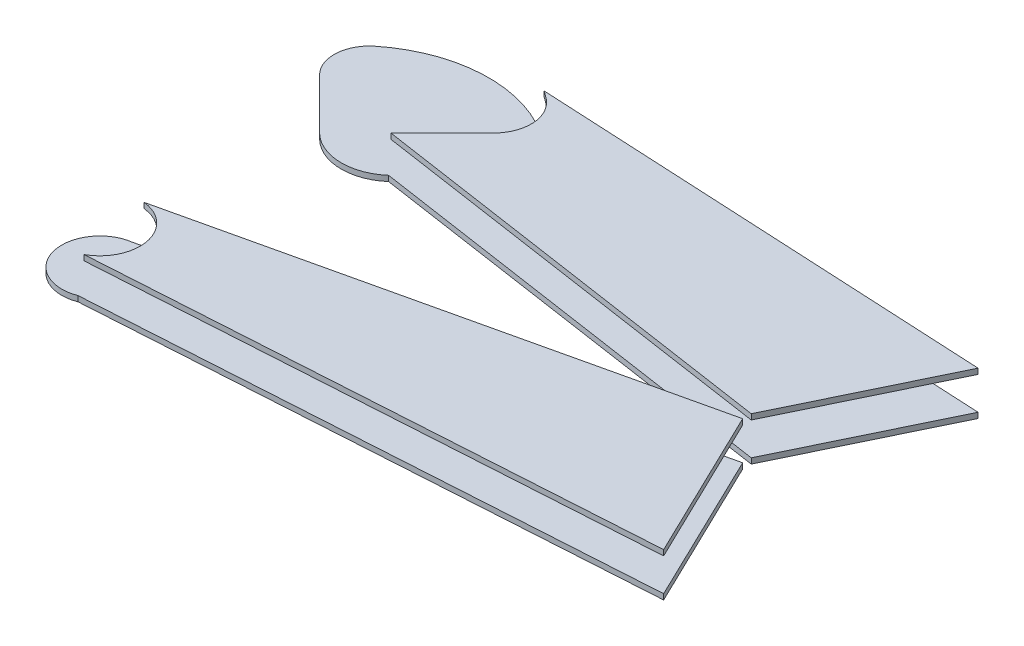
ISO-10303-21;
HEADER;
FILE_DESCRIPTION(('STEP AP214'),'2;1');
FILE_NAME('part.step','',(''),(''),'','','');
FILE_SCHEMA(('AUTOMOTIVE_DESIGN { 1 0 10303 214 1 1 1 1 }'));
ENDSEC;
DATA;
#1=APPLICATION_CONTEXT('core data for automotive mechanical design processes');
#2=APPLICATION_PROTOCOL_DEFINITION('international standard','automotive_design',2000,#1);
#3=PRODUCT_CONTEXT('',#1,'mechanical');
#4=PRODUCT('Part','Part','',(#3));
#5=PRODUCT_RELATED_PRODUCT_CATEGORY('part','',(#4));
#6=PRODUCT_DEFINITION_FORMATION('','',#4);
#7=PRODUCT_DEFINITION_CONTEXT('part definition',#1,'design');
#8=PRODUCT_DEFINITION('design','',#6,#7);
#9=PRODUCT_DEFINITION_SHAPE('','',#8);
#10=(LENGTH_UNIT() NAMED_UNIT(*) SI_UNIT(.MILLI.,.METRE.));
#11=(NAMED_UNIT(*) PLANE_ANGLE_UNIT() SI_UNIT($,.RADIAN.));
#12=(NAMED_UNIT(*) SI_UNIT($,.STERADIAN.) SOLID_ANGLE_UNIT());
#13=UNCERTAINTY_MEASURE_WITH_UNIT(LENGTH_MEASURE(1.E-05),#10,'distance_accuracy_value','');
#14=(GEOMETRIC_REPRESENTATION_CONTEXT(3) GLOBAL_UNCERTAINTY_ASSIGNED_CONTEXT((#13)) GLOBAL_UNIT_ASSIGNED_CONTEXT((#10,
#11,#12)) REPRESENTATION_CONTEXT('',''));
#15=CARTESIAN_POINT('',(0.,0.,0.));
#16=DIRECTION('',(0.,0.,1.));
#17=DIRECTION('',(1.,0.,0.));
#18=AXIS2_PLACEMENT_3D('',#15,#16,#17);
#19=CARTESIAN_POINT('',(-838.420331603245,-128.524,-220.531428961004));
#20=DIRECTION('',(0.0505562536303922,0.,-0.998721214963845));
#21=DIRECTION('',(-0.998721214963845,0.,-0.0505562536303922));
#22=AXIS2_PLACEMENT_3D('',#19,#20,#21);
#23=PLANE('',#22);
#24=DIRECTION('',(0.,1.,0.));
#25=VECTOR('',#24,1.);
#26=CARTESIAN_POINT('',(-629.067259374009,-172.973999999995,-209.933769815147));
#27=LINE('',#26,#25);
#28=CARTESIAN_POINT('',(-629.06725937401,-122.174,-209.933769815147));
#29=VERTEX_POINT('',#28);
#30=CARTESIAN_POINT('',(-629.067259374009,-128.524,-209.933769815147));
#31=VERTEX_POINT('',#30);
#32=EDGE_CURVE('E93',#29,#31,#27,.F.);
#33=ORIENTED_EDGE('',*,*,#32,.F.);
#34=DIRECTION('',(-0.998721214963845,0.,-0.0505562536303922));
#35=VECTOR('',#34,1.);
#36=CARTESIAN_POINT('',(-838.420331603245,-122.174,-220.531428961004));
#37=LINE('',#36,#35);
#38=CARTESIAN_POINT('',(-96.9999999999999,-122.174,-183.));
#39=VERTEX_POINT('',#38);
#40=EDGE_CURVE('E90',#39,#29,#37,.T.);
#41=ORIENTED_EDGE('',*,*,#40,.F.);
#42=DIRECTION('',(0.,1.,0.));
#43=VECTOR('',#42,1.);
#44=CARTESIAN_POINT('',(-96.9999999999999,-128.524,-183.));
#45=LINE('',#44,#43);
#46=CARTESIAN_POINT('',(-96.9999999999999,-128.524,-183.));
#47=VERTEX_POINT('',#46);
#48=EDGE_CURVE('E66',#47,#39,#45,.T.);
#49=ORIENTED_EDGE('',*,*,#48,.F.);
#50=DIRECTION('',(-0.998721214963845,0.,-0.0505562536303922));
#51=VECTOR('',#50,1.);
#52=CARTESIAN_POINT('',(-838.420331603245,-128.524,-220.531428961004));
#53=LINE('',#52,#51);
#54=EDGE_CURVE('E109',#47,#31,#53,.T.);
#55=ORIENTED_EDGE('',*,*,#54,.T.);
#56=EDGE_LOOP('',(#33,#41,#49,#55));
#57=FACE_BOUND('',#56,.T.);
#58=ADVANCED_FACE('F43',(#57),#23,.T.);
#59=CARTESIAN_POINT('',(-216.392471738032,-128.524,64.1146508066245));
#60=DIRECTION('',(0.900415007238885,0.,0.435031969789576));
#61=DIRECTION('',(0.435031969789576,0.,-0.900415007238885));
#62=AXIS2_PLACEMENT_3D('',#59,#60,#61);
#63=PLANE('',#62);
#64=DIRECTION('',(0.435031969789576,0.,-0.900415007238885));
#65=VECTOR('',#64,1.);
#66=CARTESIAN_POINT('',(-216.392471738032,-122.174,64.1146508066245));
#67=LINE('',#66,#65);
#68=CARTESIAN_POINT('',(-183.,-122.174,-5.00000000000005));
#69=VERTEX_POINT('',#68);
#70=EDGE_CURVE('E82',#69,#39,#67,.T.);
#71=ORIENTED_EDGE('',*,*,#70,.F.);
#72=DIRECTION('',(0.,1.,0.));
#73=VECTOR('',#72,1.);
#74=CARTESIAN_POINT('',(-183.,-128.524,-5.00000000000005));
#75=LINE('',#74,#73);
#76=CARTESIAN_POINT('',(-183.,-128.524,-5.00000000000005));
#77=VERTEX_POINT('',#76);
#78=EDGE_CURVE('E86',#77,#69,#75,.T.);
#79=ORIENTED_EDGE('',*,*,#78,.F.);
#80=DIRECTION('',(0.435031969789576,0.,-0.900415007238885));
#81=VECTOR('',#80,1.);
#82=CARTESIAN_POINT('',(-216.392471738032,-128.524,64.1146508066245));
#83=LINE('',#82,#81);
#84=EDGE_CURVE('E84',#77,#47,#83,.T.);
#85=ORIENTED_EDGE('',*,*,#84,.T.);
#86=ORIENTED_EDGE('',*,*,#48,.T.);
#87=EDGE_LOOP('',(#71,#79,#85,#86));
#88=FACE_BOUND('',#87,.T.);
#89=ADVANCED_FACE('F79',(#88),#63,.T.);
#90=CARTESIAN_POINT('',(-857.084771467849,-128.524,-105.222131912697));
#91=DIRECTION('',(-0.147062275293934,0.,0.989127235084229));
#92=DIRECTION('',(0.989127235084229,0.,0.147062275293934));
#93=AXIS2_PLACEMENT_3D('',#90,#91,#92);
#94=PLANE('',#93);
#95=DIRECTION('',(0.,1.,0.));
#96=VECTOR('',#95,1.);
#97=CARTESIAN_POINT('',(-675.952387640038,-172.973999999995,-78.2915818779856));
#98=LINE('',#97,#96);
#99=CARTESIAN_POINT('',(-675.952387640038,-128.524,-78.2915818779856));
#100=VERTEX_POINT('',#99);
#101=CARTESIAN_POINT('',(-675.952387640038,-122.174,-78.2915818779856));
#102=VERTEX_POINT('',#101);
#103=EDGE_CURVE('E142',#100,#102,#98,.T.);
#104=ORIENTED_EDGE('',*,*,#103,.F.);
#105=DIRECTION('',(0.989127235084229,0.,0.147062275293934));
#106=VECTOR('',#105,1.);
#107=CARTESIAN_POINT('',(-857.084771467849,-128.524,-105.222131912697));
#108=LINE('',#107,#106);
#109=EDGE_CURVE('E96',#100,#77,#108,.T.);
#110=ORIENTED_EDGE('',*,*,#109,.T.);
#111=ORIENTED_EDGE('',*,*,#78,.T.);
#112=DIRECTION('',(0.989127235084229,0.,0.147062275293934));
#113=VECTOR('',#112,1.);
#114=CARTESIAN_POINT('',(-857.084771467849,-122.174,-105.222131912697));
#115=LINE('',#114,#113);
#116=EDGE_CURVE('E101',#102,#69,#115,.T.);
#117=ORIENTED_EDGE('',*,*,#116,.F.);
#118=EDGE_LOOP('',(#104,#110,#111,#117));
#119=FACE_BOUND('',#118,.T.);
#120=ADVANCED_FACE('F45',(#119),#94,.T.);
#121=CARTESIAN_POINT('',(-719.067867535307,-128.524,-124.701940777126));
#122=DIRECTION('',(0.,1.,0.));
#123=DIRECTION('',(0.,0.,1.));
#124=AXIS2_PLACEMENT_3D('',#121,#122,#123);
#125=PLANE('',#124);
#126=ORIENTED_EDGE('',*,*,#109,.F.);
#127=CARTESIAN_POINT('',(-719.067867535307,-128.524,-124.701940777126));
#128=DIRECTION('',(0.,1.,0.));
#129=DIRECTION('',(0.,0.,1.));
#130=AXIS2_PLACEMENT_3D('',#127,#128,#129);
#131=CIRCLE('',#130,63.34718636014);
#132=CARTESIAN_POINT('',(-674.274642490964,-128.524,-79.9087157327826));
#133=VERTEX_POINT('',#132);
#134=EDGE_CURVE('E104',#100,#133,#131,.T.);
#135=ORIENTED_EDGE('',*,*,#134,.T.);
#136=DIRECTION('',(0.707106781186547,0.,-0.707106781186548));
#137=VECTOR('',#136,1.);
#138=CARTESIAN_POINT('',(-674.274642490964,-128.524,-79.9087157327827));
#139=LINE('',#138,#137);
#140=CARTESIAN_POINT('',(-615.88666149142,-128.524,-138.296696732326));
#141=VERTEX_POINT('',#140);
#142=EDGE_CURVE('E161',#133,#141,#139,.T.);
#143=ORIENTED_EDGE('',*,*,#142,.T.);
#144=CARTESIAN_POINT('',(-646.537750912032,-128.524,-168.947786152938));
#145=DIRECTION('',(0.,1.,0.));
#146=DIRECTION('',(0.,0.,1.));
#147=AXIS2_PLACEMENT_3D('',#144,#145,#146);
#148=CIRCLE('',#147,43.3471863601399);
#149=CARTESIAN_POINT('',(-619.375967050333,-128.524,-202.729675721034));
#150=VERTEX_POINT('',#149);
#151=EDGE_CURVE('E156',#141,#150,#148,.T.);
#152=ORIENTED_EDGE('',*,*,#151,.T.);
#153=CARTESIAN_POINT('',(-719.067867535307,-128.524,-78.74));
#154=DIRECTION('',(0.,1.,0.));
#155=DIRECTION('',(0.,0.,1.));
#156=AXIS2_PLACEMENT_3D('',#153,#154,#155);
#157=CIRCLE('',#156,159.09718636014);
#158=EDGE_CURVE('E149',#150,#31,#157,.T.);
#159=ORIENTED_EDGE('',*,*,#158,.T.);
#160=ORIENTED_EDGE('',*,*,#54,.F.);
#161=ORIENTED_EDGE('',*,*,#84,.F.);
#162=EDGE_LOOP('',(#126,#135,#143,#152,#159,#160,#161));
#163=FACE_BOUND('',#162,.T.);
#164=ADVANCED_FACE('F151',(#163),#125,.F.);
#165=CARTESIAN_POINT('',(-719.067867535307,-122.174,-124.701940777126));
#166=DIRECTION('',(0.,1.,0.));
#167=DIRECTION('',(0.,0.,1.));
#168=AXIS2_PLACEMENT_3D('',#165,#166,#167);
#169=PLANE('',#168);
#170=CARTESIAN_POINT('',(-719.067867535307,-122.174,-124.701940777126));
#171=DIRECTION('',(0.,1.,0.));
#172=DIRECTION('',(0.,0.,1.));
#173=AXIS2_PLACEMENT_3D('',#170,#171,#172);
#174=CIRCLE('',#173,63.34718636014);
#175=CARTESIAN_POINT('',(-674.274642490964,-122.174,-79.9087157327826));
#176=VERTEX_POINT('',#175);
#177=EDGE_CURVE('E12',#102,#176,#174,.T.);
#178=ORIENTED_EDGE('',*,*,#177,.F.);
#179=ORIENTED_EDGE('',*,*,#116,.T.);
#180=ORIENTED_EDGE('',*,*,#70,.T.);
#181=ORIENTED_EDGE('',*,*,#40,.T.);
#182=CARTESIAN_POINT('',(-719.067867535307,-122.174,-78.74));
#183=DIRECTION('',(0.,1.,0.));
#184=DIRECTION('',(0.,0.,1.));
#185=AXIS2_PLACEMENT_3D('',#182,#183,#184);
#186=CIRCLE('',#185,159.09718636014);
#187=CARTESIAN_POINT('',(-619.375967050333,-122.174,-202.729675721034));
#188=VERTEX_POINT('',#187);
#189=EDGE_CURVE('E51',#188,#29,#186,.T.);
#190=ORIENTED_EDGE('',*,*,#189,.F.);
#191=CARTESIAN_POINT('',(-646.537750912032,-122.174,-168.947786152938));
#192=DIRECTION('',(0.,1.,0.));
#193=DIRECTION('',(0.,0.,1.));
#194=AXIS2_PLACEMENT_3D('',#191,#192,#193);
#195=CIRCLE('',#194,43.3471863601399);
#196=CARTESIAN_POINT('',(-615.88666149142,-122.174,-138.296696732326));
#197=VERTEX_POINT('',#196);
#198=EDGE_CURVE('E111',#197,#188,#195,.T.);
#199=ORIENTED_EDGE('',*,*,#198,.F.);
#200=DIRECTION('',(0.707106781186547,0.,-0.707106781186548));
#201=VECTOR('',#200,1.);
#202=CARTESIAN_POINT('',(-674.274642490964,-122.174,-79.9087157327827));
#203=LINE('',#202,#201);
#204=EDGE_CURVE('E85',#176,#197,#203,.T.);
#205=ORIENTED_EDGE('',*,*,#204,.F.);
#206=EDGE_LOOP('',(#178,#179,#180,#181,#190,#199,#205));
#207=FACE_BOUND('',#206,.T.);
#208=ADVANCED_FACE('F99',(#207),#169,.T.);
#209=CARTESIAN_POINT('',(-719.067867535307,-172.973999999995,-124.701940777126));
#210=DIRECTION('',(0.,1.,0.));
#211=DIRECTION('',(0.,0.,1.));
#212=AXIS2_PLACEMENT_3D('',#209,#210,#211);
#213=CYLINDRICAL_SURFACE('',#212,63.34718636014);
#214=ORIENTED_EDGE('',*,*,#103,.T.);
#215=ORIENTED_EDGE('',*,*,#177,.T.);
#216=DIRECTION('',(0.,1.,0.));
#217=VECTOR('',#216,1.);
#218=CARTESIAN_POINT('',(-674.274642490964,-172.973999999995,-79.9087157327826));
#219=LINE('',#218,#217);
#220=EDGE_CURVE('E58',#133,#176,#219,.T.);
#221=ORIENTED_EDGE('',*,*,#220,.F.);
#222=ORIENTED_EDGE('',*,*,#134,.F.);
#223=EDGE_LOOP('',(#214,#215,#221,#222));
#224=FACE_BOUND('',#223,.T.);
#225=ADVANCED_FACE('F141',(#224),#213,.F.);
#226=CARTESIAN_POINT('',(-719.067867535307,-172.973999999995,-78.74));
#227=DIRECTION('',(0.,1.,0.));
#228=DIRECTION('',(0.,0.,1.));
#229=AXIS2_PLACEMENT_3D('',#226,#227,#228);
#230=CYLINDRICAL_SURFACE('',#229,159.09718636014);
#231=DIRECTION('',(0.,1.,0.));
#232=VECTOR('',#231,1.);
#233=CARTESIAN_POINT('',(-619.375967050333,-172.973999999995,-202.729675721034));
#234=LINE('',#233,#232);
#235=EDGE_CURVE('E122',#150,#188,#234,.T.);
#236=ORIENTED_EDGE('',*,*,#235,.T.);
#237=ORIENTED_EDGE('',*,*,#189,.T.);
#238=ORIENTED_EDGE('',*,*,#32,.T.);
#239=ORIENTED_EDGE('',*,*,#158,.F.);
#240=EDGE_LOOP('',(#236,#237,#238,#239));
#241=FACE_BOUND('',#240,.T.);
#242=ADVANCED_FACE('F116',(#241),#230,.F.);
#243=CARTESIAN_POINT('',(-646.537750912032,-172.973999999995,-168.947786152938));
#244=DIRECTION('',(0.,1.,0.));
#245=DIRECTION('',(0.,0.,1.));
#246=AXIS2_PLACEMENT_3D('',#243,#244,#245);
#247=CYLINDRICAL_SURFACE('',#246,43.3471863601399);
#248=DIRECTION('',(0.,1.,0.));
#249=VECTOR('',#248,1.);
#250=CARTESIAN_POINT('',(-615.88666149142,-172.973999999995,-138.296696732326));
#251=LINE('',#250,#249);
#252=EDGE_CURVE('E164',#141,#197,#251,.T.);
#253=ORIENTED_EDGE('',*,*,#252,.T.);
#254=ORIENTED_EDGE('',*,*,#198,.T.);
#255=ORIENTED_EDGE('',*,*,#235,.F.);
#256=ORIENTED_EDGE('',*,*,#151,.F.);
#257=EDGE_LOOP('',(#253,#254,#255,#256));
#258=FACE_BOUND('',#257,.T.);
#259=ADVANCED_FACE('F167',(#258),#247,.F.);
#260=CARTESIAN_POINT('',(-674.274642490964,-172.973999999995,-79.9087157327826));
#261=DIRECTION('',(0.707106781186548,0.,0.707106781186547));
#262=DIRECTION('',(0.707106781186547,0.,-0.707106781186548));
#263=AXIS2_PLACEMENT_3D('',#260,#261,#262);
#264=PLANE('',#263);
#265=ORIENTED_EDGE('',*,*,#220,.T.);
#266=ORIENTED_EDGE('',*,*,#204,.T.);
#267=ORIENTED_EDGE('',*,*,#252,.F.);
#268=ORIENTED_EDGE('',*,*,#142,.F.);
#269=EDGE_LOOP('',(#265,#266,#267,#268));
#270=FACE_BOUND('',#269,.T.);
#271=ADVANCED_FACE('F169',(#270),#264,.F.);
#272=CLOSED_SHELL('',(#58,#89,#120,#164,#208,#225,#242,#259,#271));
#273=MANIFOLD_SOLID_BREP('B2',#272);
#274=CARTESIAN_POINT('',(-808.496769315492,-128.524,227.706016824532));
#275=DIRECTION('',(0.0627100890896896,0.,0.998031785428883));
#276=DIRECTION('',(0.998031785428883,0.,-0.0627100890896896));
#277=AXIS2_PLACEMENT_3D('',#274,#275,#276);
#278=PLANE('',#277);
#279=DIRECTION('',(0.,1.,0.));
#280=VECTOR('',#279,1.);
#281=CARTESIAN_POINT('',(-731.974677377489,-172.973999999995,222.897846110109));
#282=LINE('',#281,#280);
#283=CARTESIAN_POINT('',(-731.974677377489,-128.524,222.897846110109));
#284=VERTEX_POINT('',#283);
#285=CARTESIAN_POINT('',(-731.974677377489,-122.174,222.897846110109));
#286=VERTEX_POINT('',#285);
#287=EDGE_CURVE('E267',#284,#286,#282,.T.);
#288=ORIENTED_EDGE('',*,*,#287,.F.);
#289=DIRECTION('',(0.998031785428883,0.,-0.0627100890896896));
#290=VECTOR('',#289,1.);
#291=CARTESIAN_POINT('',(-808.496769315492,-128.524,227.706016824532));
#292=LINE('',#291,#290);
#293=CARTESIAN_POINT('',(-97.,-128.524,183.));
#294=VERTEX_POINT('',#293);
#295=EDGE_CURVE('E304',#284,#294,#292,.T.);
#296=ORIENTED_EDGE('',*,*,#295,.T.);
#297=DIRECTION('',(0.,1.,0.));
#298=VECTOR('',#297,1.);
#299=CARTESIAN_POINT('',(-97.,-128.524,183.));
#300=LINE('',#299,#298);
#301=CARTESIAN_POINT('',(-97.,-122.174,183.));
#302=VERTEX_POINT('',#301);
#303=EDGE_CURVE('E294',#294,#302,#300,.T.);
#304=ORIENTED_EDGE('',*,*,#303,.T.);
#305=DIRECTION('',(0.998031785428883,0.,-0.0627100890896896));
#306=VECTOR('',#305,1.);
#307=CARTESIAN_POINT('',(-808.496769315492,-122.174,227.706016824532));
#308=LINE('',#307,#306);
#309=EDGE_CURVE('E308',#286,#302,#308,.T.);
#310=ORIENTED_EDGE('',*,*,#309,.F.);
#311=EDGE_LOOP('',(#288,#296,#304,#310));
#312=FACE_BOUND('',#311,.T.);
#313=ADVANCED_FACE('F254',(#312),#278,.T.);
#314=CARTESIAN_POINT('',(-752.09528534578,-128.524,135.888115134921));
#315=DIRECTION('',(-0.224141511684438,0.,-0.974556608278768));
#316=DIRECTION('',(-0.974556608278768,0.,0.224141511684438));
#317=AXIS2_PLACEMENT_3D('',#314,#315,#316);
#318=PLANE('',#317);
#319=DIRECTION('',(0.,1.,0.));
#320=VECTOR('',#319,1.);
#321=CARTESIAN_POINT('',(-749.475530412088,-172.973999999995,135.285588995247));
#322=LINE('',#321,#320);
#323=CARTESIAN_POINT('',(-749.475530412087,-122.174,135.285588995247));
#324=VERTEX_POINT('',#323);
#325=CARTESIAN_POINT('',(-749.475530412088,-128.524,135.285588995247));
#326=VERTEX_POINT('',#325);
#327=EDGE_CURVE('E302',#324,#326,#322,.F.);
#328=ORIENTED_EDGE('',*,*,#327,.F.);
#329=DIRECTION('',(-0.974556608278767,0.,0.224141511684438));
#330=VECTOR('',#329,1.);
#331=CARTESIAN_POINT('',(-752.09528534578,-122.174,135.888115134921));
#332=LINE('',#331,#330);
#333=CARTESIAN_POINT('',(-183.,-122.174,5.));
#334=VERTEX_POINT('',#333);
#335=EDGE_CURVE('E298',#334,#324,#332,.T.);
#336=ORIENTED_EDGE('',*,*,#335,.F.);
#337=DIRECTION('',(0.,1.,0.));
#338=VECTOR('',#337,1.);
#339=CARTESIAN_POINT('',(-183.,-128.524,5.));
#340=LINE('',#339,#338);
#341=CARTESIAN_POINT('',(-183.,-128.524,5.));
#342=VERTEX_POINT('',#341);
#343=EDGE_CURVE('E261',#342,#334,#340,.T.);
#344=ORIENTED_EDGE('',*,*,#343,.F.);
#345=DIRECTION('',(-0.974556608278767,0.,0.224141511684438));
#346=VECTOR('',#345,1.);
#347=CARTESIAN_POINT('',(-752.09528534578,-128.524,135.888115134921));
#348=LINE('',#347,#346);
#349=EDGE_CURVE('E314',#342,#326,#348,.T.);
#350=ORIENTED_EDGE('',*,*,#349,.T.);
#351=EDGE_LOOP('',(#328,#336,#344,#350));
#352=FACE_BOUND('',#351,.T.);
#353=ADVANCED_FACE('F299',(#352),#318,.T.);
#354=CARTESIAN_POINT('',(-401.30782525425,-128.524,-446.84642901461));
#355=DIRECTION('',(0.900415007238886,0.,-0.435031969789574));
#356=DIRECTION('',(-0.435031969789574,0.,-0.900415007238886));
#357=AXIS2_PLACEMENT_3D('',#354,#355,#356);
#358=PLANE('',#357);
#359=DIRECTION('',(-0.435031969789574,0.,-0.900415007238886));
#360=VECTOR('',#359,1.);
#361=CARTESIAN_POINT('',(-401.30782525425,-122.174,-446.84642901461));
#362=LINE('',#361,#360);
#363=EDGE_CURVE('E291',#302,#334,#362,.T.);
#364=ORIENTED_EDGE('',*,*,#363,.F.);
#365=ORIENTED_EDGE('',*,*,#303,.F.);
#366=DIRECTION('',(-0.435031969789574,0.,-0.900415007238886));
#367=VECTOR('',#366,1.);
#368=CARTESIAN_POINT('',(-401.30782525425,-128.524,-446.84642901461));
#369=LINE('',#368,#367);
#370=EDGE_CURVE('E293',#294,#342,#369,.T.);
#371=ORIENTED_EDGE('',*,*,#370,.T.);
#372=ORIENTED_EDGE('',*,*,#343,.T.);
#373=EDGE_LOOP('',(#364,#365,#371,#372));
#374=FACE_BOUND('',#373,.T.);
#375=ADVANCED_FACE('F288',(#374),#358,.T.);
#376=CARTESIAN_POINT('',(-754.50638834792,-128.524,181.844577047281));
#377=DIRECTION('',(0.,1.,0.));
#378=DIRECTION('',(0.,0.,1.));
#379=AXIS2_PLACEMENT_3D('',#376,#377,#378);
#380=PLANE('',#379);
#381=ORIENTED_EDGE('',*,*,#295,.F.);
#382=CARTESIAN_POINT('',(-754.50638834792,-128.524,181.844577047281));
#383=DIRECTION('',(0.,1.,0.));
#384=DIRECTION('',(0.,0.,1.));
#385=AXIS2_PLACEMENT_3D('',#382,#383,#384);
#386=CIRCLE('',#385,46.83);
#387=EDGE_CURVE('E311',#284,#326,#386,.T.);
#388=ORIENTED_EDGE('',*,*,#387,.T.);
#389=ORIENTED_EDGE('',*,*,#349,.F.);
#390=ORIENTED_EDGE('',*,*,#370,.F.);
#391=EDGE_LOOP('',(#381,#388,#389,#390));
#392=FACE_BOUND('',#391,.T.);
#393=ADVANCED_FACE('F327',(#392),#380,.F.);
#394=CARTESIAN_POINT('',(-754.50638834792,-122.174,181.844577047281));
#395=DIRECTION('',(0.,1.,0.));
#396=DIRECTION('',(0.,0.,1.));
#397=AXIS2_PLACEMENT_3D('',#394,#395,#396);
#398=PLANE('',#397);
#399=CARTESIAN_POINT('',(-754.50638834792,-122.174,181.844577047281));
#400=DIRECTION('',(0.,1.,0.));
#401=DIRECTION('',(0.,0.,1.));
#402=AXIS2_PLACEMENT_3D('',#399,#400,#401);
#403=CIRCLE('',#402,46.83);
#404=EDGE_CURVE('E41',#286,#324,#403,.T.);
#405=ORIENTED_EDGE('',*,*,#404,.F.);
#406=ORIENTED_EDGE('',*,*,#309,.T.);
#407=ORIENTED_EDGE('',*,*,#363,.T.);
#408=ORIENTED_EDGE('',*,*,#335,.T.);
#409=EDGE_LOOP('',(#405,#406,#407,#408));
#410=FACE_BOUND('',#409,.T.);
#411=ADVANCED_FACE('F306',(#410),#398,.T.);
#412=CARTESIAN_POINT('',(-754.50638834792,-172.973999999995,181.844577047281));
#413=DIRECTION('',(0.,1.,0.));
#414=DIRECTION('',(0.,0.,1.));
#415=AXIS2_PLACEMENT_3D('',#412,#413,#414);
#416=CYLINDRICAL_SURFACE('',#415,46.83);
#417=ORIENTED_EDGE('',*,*,#287,.T.);
#418=ORIENTED_EDGE('',*,*,#404,.T.);
#419=ORIENTED_EDGE('',*,*,#327,.T.);
#420=ORIENTED_EDGE('',*,*,#387,.F.);
#421=EDGE_LOOP('',(#417,#418,#419,#420));
#422=FACE_BOUND('',#421,.T.);
#423=ADVANCED_FACE('F323',(#422),#416,.F.);
#424=CLOSED_SHELL('',(#313,#353,#375,#393,#411,#423));
#425=MANIFOLD_SOLID_BREP('B6',#424);
#426=CARTESIAN_POINT('',(-719.067867535307,-166.623999999995,-78.74));
#427=DIRECTION('',(0.,-1.,0.));
#428=DIRECTION('',(0.,0.,-1.));
#429=AXIS2_PLACEMENT_3D('',#426,#427,#428);
#430=CYLINDRICAL_SURFACE('',#429,156.71718636014);
#431=CARTESIAN_POINT('',(-719.067867535307,-172.973999999995,-78.74));
#432=DIRECTION('',(0.,-1.,0.));
#433=DIRECTION('',(0.,0.,-1.));
#434=AXIS2_PLACEMENT_3D('',#431,#432,#433);
#435=CIRCLE('',#434,156.71718636014);
#436=CARTESIAN_POINT('',(-817.268436032693,-172.973999999995,-200.874863357802));
#437=VERTEX_POINT('',#436);
#438=CARTESIAN_POINT('',(-633.705018705783,-172.973999999995,-210.168537769948));
#439=VERTEX_POINT('',#438);
#440=EDGE_CURVE('E477',#437,#439,#435,.T.);
#441=ORIENTED_EDGE('',*,*,#440,.F.);
#442=DIRECTION('',(0.,-1.,0.));
#443=VECTOR('',#442,1.);
#444=CARTESIAN_POINT('',(-817.268436032693,-166.623999999995,-200.874863357802));
#445=LINE('',#444,#443);
#446=CARTESIAN_POINT('',(-817.268436032693,-166.623999999995,-200.874863357802));
#447=VERTEX_POINT('',#446);
#448=EDGE_CURVE('E252',#447,#437,#445,.T.);
#449=ORIENTED_EDGE('',*,*,#448,.F.);
#450=CARTESIAN_POINT('',(-719.067867535307,-166.623999999995,-78.74));
#451=DIRECTION('',(0.,-1.,0.));
#452=DIRECTION('',(0.,0.,-1.));
#453=AXIS2_PLACEMENT_3D('',#450,#451,#452);
#454=CIRCLE('',#453,156.71718636014);
#455=CARTESIAN_POINT('',(-633.705018705783,-166.623999999995,-210.168537769948));
#456=VERTEX_POINT('',#455);
#457=EDGE_CURVE('E494',#447,#456,#454,.T.);
#458=ORIENTED_EDGE('',*,*,#457,.T.);
#459=DIRECTION('',(0.,-1.,0.));
#460=VECTOR('',#459,1.);
#461=CARTESIAN_POINT('',(-633.705018705783,-166.623999999995,-210.168537769948));
#462=LINE('',#461,#460);
#463=EDGE_CURVE('E389',#456,#439,#462,.T.);
#464=ORIENTED_EDGE('',*,*,#463,.T.);
#465=EDGE_LOOP('',(#441,#449,#458,#464));
#466=FACE_BOUND('',#465,.T.);
#467=ADVANCED_FACE('F386',(#466),#430,.T.);
#468=CARTESIAN_POINT('',(-791.597984158582,-166.623999999995,-168.947786152938));
#469=DIRECTION('',(0.,-1.,0.));
#470=DIRECTION('',(0.,0.,-1.));
#471=AXIS2_PLACEMENT_3D('',#468,#469,#470);
#472=CYLINDRICAL_SURFACE('',#471,40.9671863601399);
#473=CARTESIAN_POINT('',(-791.597984158582,-172.973999999995,-168.947786152938));
#474=DIRECTION('',(0.,-1.,0.));
#475=DIRECTION('',(0.,0.,-1.));
#476=AXIS2_PLACEMENT_3D('',#473,#474,#475);
#477=CIRCLE('',#476,40.9671863601399);
#478=CARTESIAN_POINT('',(-820.566159439969,-172.973999999995,-139.97961087155));
#479=VERTEX_POINT('',#478);
#480=EDGE_CURVE('E492',#479,#437,#477,.T.);
#481=ORIENTED_EDGE('',*,*,#480,.F.);
#482=DIRECTION('',(0.,-1.,0.));
#483=VECTOR('',#482,1.);
#484=CARTESIAN_POINT('',(-820.566159439969,-166.623999999995,-139.97961087155));
#485=LINE('',#484,#483);
#486=CARTESIAN_POINT('',(-820.566159439969,-166.623999999995,-139.97961087155));
#487=VERTEX_POINT('',#486);
#488=EDGE_CURVE('E395',#487,#479,#485,.T.);
#489=ORIENTED_EDGE('',*,*,#488,.F.);
#490=CARTESIAN_POINT('',(-791.597984158582,-166.623999999995,-168.947786152938));
#491=DIRECTION('',(0.,-1.,0.));
#492=DIRECTION('',(0.,0.,-1.));
#493=AXIS2_PLACEMENT_3D('',#490,#491,#492);
#494=CIRCLE('',#493,40.9671863601399);
#495=EDGE_CURVE('E467',#487,#447,#494,.T.);
#496=ORIENTED_EDGE('',*,*,#495,.T.);
#497=ORIENTED_EDGE('',*,*,#448,.T.);
#498=EDGE_LOOP('',(#481,#489,#496,#497));
#499=FACE_BOUND('',#498,.T.);
#500=ADVANCED_FACE('F504',(#499),#472,.T.);
#501=CARTESIAN_POINT('',(-340.293274284209,-166.623999999995,340.293274284209));
#502=DIRECTION('',(-0.707106781186547,0.,0.707106781186548));
#503=DIRECTION('',(0.707106781186548,0.,0.707106781186547));
#504=AXIS2_PLACEMENT_3D('',#501,#502,#503);
#505=PLANE('',#504);
#506=DIRECTION('',(-0.707106781186548,0.,-0.707106781186547));
#507=VECTOR('',#506,1.);
#508=CARTESIAN_POINT('',(-340.293274284209,-172.973999999995,340.293274284209));
#509=LINE('',#508,#507);
#510=CARTESIAN_POINT('',(-762.178178440426,-172.973999999995,-81.5916298720067));
#511=VERTEX_POINT('',#510);
#512=EDGE_CURVE('E454',#511,#479,#509,.T.);
#513=ORIENTED_EDGE('',*,*,#512,.F.);
#514=DIRECTION('',(0.,-1.,0.));
#515=VECTOR('',#514,1.);
#516=CARTESIAN_POINT('',(-762.178178440426,-166.623999999995,-81.5916298720067));
#517=LINE('',#516,#515);
#518=CARTESIAN_POINT('',(-762.178178440426,-166.623999999995,-81.5916298720067));
#519=VERTEX_POINT('',#518);
#520=EDGE_CURVE('E449',#519,#511,#517,.T.);
#521=ORIENTED_EDGE('',*,*,#520,.F.);
#522=DIRECTION('',(-0.707106781186548,0.,-0.707106781186547));
#523=VECTOR('',#522,1.);
#524=CARTESIAN_POINT('',(-340.293274284209,-166.623999999995,340.293274284209));
#525=LINE('',#524,#523);
#526=EDGE_CURVE('E452',#519,#487,#525,.T.);
#527=ORIENTED_EDGE('',*,*,#526,.T.);
#528=ORIENTED_EDGE('',*,*,#488,.T.);
#529=EDGE_LOOP('',(#513,#521,#527,#528));
#530=FACE_BOUND('',#529,.T.);
#531=ADVANCED_FACE('F451',(#530),#505,.T.);
#532=CARTESIAN_POINT('',(-719.067867535307,-166.623999999995,-124.701940777126));
#533=DIRECTION('',(0.,-1.,0.));
#534=DIRECTION('',(0.,0.,-1.));
#535=AXIS2_PLACEMENT_3D('',#532,#533,#534);
#536=CYLINDRICAL_SURFACE('',#535,60.96718636014);
#537=CARTESIAN_POINT('',(-719.067867535307,-172.973999999995,-124.701940777126));
#538=DIRECTION('',(0.,-1.,0.));
#539=DIRECTION('',(0.,0.,-1.));
#540=AXIS2_PLACEMENT_3D('',#537,#538,#539);
#541=CIRCLE('',#540,60.96718636014);
#542=CARTESIAN_POINT('',(-679.005377883812,-172.973999999995,-78.7454968808023));
#543=VERTEX_POINT('',#542);
#544=EDGE_CURVE('E489',#543,#511,#541,.T.);
#545=ORIENTED_EDGE('',*,*,#544,.F.);
#546=DIRECTION('',(0.,-1.,0.));
#547=VECTOR('',#546,1.);
#548=CARTESIAN_POINT('',(-679.005377883812,-166.623999999995,-78.7454968808023));
#549=LINE('',#548,#547);
#550=CARTESIAN_POINT('',(-679.005377883812,-166.623999999995,-78.7454968808023));
#551=VERTEX_POINT('',#550);
#552=EDGE_CURVE('E459',#551,#543,#549,.T.);
#553=ORIENTED_EDGE('',*,*,#552,.F.);
#554=CARTESIAN_POINT('',(-719.067867535307,-166.623999999995,-124.701940777126));
#555=DIRECTION('',(0.,-1.,0.));
#556=DIRECTION('',(0.,0.,-1.));
#557=AXIS2_PLACEMENT_3D('',#554,#555,#556);
#558=CIRCLE('',#557,60.96718636014);
#559=EDGE_CURVE('E465',#551,#519,#558,.T.);
#560=ORIENTED_EDGE('',*,*,#559,.T.);
#561=ORIENTED_EDGE('',*,*,#520,.T.);
#562=EDGE_LOOP('',(#545,#553,#560,#561));
#563=FACE_BOUND('',#562,.T.);
#564=ADVANCED_FACE('F469',(#563),#536,.T.);
#565=CARTESIAN_POINT('',(-3.23048173634369,-166.623999999995,21.7279207837164));
#566=DIRECTION('',(-0.147062275293934,0.,0.989127235084229));
#567=DIRECTION('',(0.989127235084229,0.,0.147062275293934));
#568=AXIS2_PLACEMENT_3D('',#565,#566,#567);
#569=PLANE('',#568);
#570=DIRECTION('',(-0.989127235084229,0.,-0.147062275293934));
#571=VECTOR('',#570,1.);
#572=CARTESIAN_POINT('',(-3.23048173634369,-172.973999999995,21.7279207837164));
#573=LINE('',#572,#571);
#574=CARTESIAN_POINT('',(-183.,-172.973999999995,-5.00000000000001));
#575=VERTEX_POINT('',#574);
#576=EDGE_CURVE('E486',#575,#543,#573,.T.);
#577=ORIENTED_EDGE('',*,*,#576,.F.);
#578=DIRECTION('',(0.,-1.,0.));
#579=VECTOR('',#578,1.);
#580=CARTESIAN_POINT('',(-183.,-166.623999999995,-5.00000000000001));
#581=LINE('',#580,#579);
#582=CARTESIAN_POINT('',(-183.,-166.623999999995,-5.00000000000001));
#583=VERTEX_POINT('',#582);
#584=EDGE_CURVE('E498',#583,#575,#581,.T.);
#585=ORIENTED_EDGE('',*,*,#584,.F.);
#586=DIRECTION('',(-0.989127235084229,0.,-0.147062275293934));
#587=VECTOR('',#586,1.);
#588=CARTESIAN_POINT('',(-3.23048173634369,-166.623999999995,21.7279207837164));
#589=LINE('',#588,#587);
#590=EDGE_CURVE('E470',#583,#551,#589,.T.);
#591=ORIENTED_EDGE('',*,*,#590,.T.);
#592=ORIENTED_EDGE('',*,*,#552,.T.);
#593=EDGE_LOOP('',(#577,#585,#591,#592));
#594=FACE_BOUND('',#593,.T.);
#595=ADVANCED_FACE('F517',(#594),#569,.T.);
#596=CARTESIAN_POINT('',(-150.3252814739,-166.623999999995,-72.6290685772779));
#597=DIRECTION('',(0.900415007238885,0.,0.435031969789576));
#598=DIRECTION('',(0.435031969789576,0.,-0.900415007238885));
#599=AXIS2_PLACEMENT_3D('',#596,#597,#598);
#600=PLANE('',#599);
#601=DIRECTION('',(-0.435031969789576,0.,0.900415007238885));
#602=VECTOR('',#601,1.);
#603=CARTESIAN_POINT('',(-150.3252814739,-172.973999999995,-72.6290685772779));
#604=LINE('',#603,#602);
#605=CARTESIAN_POINT('',(-97.,-172.973999999995,-183.));
#606=VERTEX_POINT('',#605);
#607=EDGE_CURVE('E483',#606,#575,#604,.T.);
#608=ORIENTED_EDGE('',*,*,#607,.F.);
#609=DIRECTION('',(0.,-1.,0.));
#610=VECTOR('',#609,1.);
#611=CARTESIAN_POINT('',(-97.,-166.623999999995,-183.));
#612=LINE('',#611,#610);
#613=CARTESIAN_POINT('',(-97.,-166.623999999995,-183.));
#614=VERTEX_POINT('',#613);
#615=EDGE_CURVE('E499',#614,#606,#612,.T.);
#616=ORIENTED_EDGE('',*,*,#615,.F.);
#617=DIRECTION('',(-0.435031969789576,0.,0.900415007238885));
#618=VECTOR('',#617,1.);
#619=CARTESIAN_POINT('',(-150.3252814739,-166.623999999995,-72.6290685772779));
#620=LINE('',#619,#618);
#621=EDGE_CURVE('E472',#614,#583,#620,.T.);
#622=ORIENTED_EDGE('',*,*,#621,.T.);
#623=ORIENTED_EDGE('',*,*,#584,.T.);
#624=EDGE_LOOP('',(#608,#616,#622,#623));
#625=FACE_BOUND('',#624,.T.);
#626=ADVANCED_FACE('F520',(#625),#600,.T.);
#627=CARTESIAN_POINT('',(8.99203768433646,-166.623999999995,-177.634578439224));
#628=DIRECTION('',(0.0505562536303922,0.,-0.998721214963845));
#629=DIRECTION('',(-0.998721214963845,0.,-0.0505562536303922));
#630=AXIS2_PLACEMENT_3D('',#627,#628,#629);
#631=PLANE('',#630);
#632=DIRECTION('',(0.998721214963845,0.,0.0505562536303922));
#633=VECTOR('',#632,1.);
#634=CARTESIAN_POINT('',(8.99203768433646,-172.973999999995,-177.634578439224));
#635=LINE('',#634,#633);
#636=EDGE_CURVE('E480',#439,#606,#635,.T.);
#637=ORIENTED_EDGE('',*,*,#636,.F.);
#638=ORIENTED_EDGE('',*,*,#463,.F.);
#639=DIRECTION('',(0.998721214963845,0.,0.0505562536303922));
#640=VECTOR('',#639,1.);
#641=CARTESIAN_POINT('',(8.99203768433646,-166.623999999995,-177.634578439224));
#642=LINE('',#641,#640);
#643=EDGE_CURVE('E582',#456,#614,#642,.T.);
#644=ORIENTED_EDGE('',*,*,#643,.T.);
#645=ORIENTED_EDGE('',*,*,#615,.T.);
#646=EDGE_LOOP('',(#637,#638,#644,#645));
#647=FACE_BOUND('',#646,.T.);
#648=ADVANCED_FACE('F501',(#647),#631,.T.);
#649=CARTESIAN_POINT('',(-719.067867535307,-166.623999999995,-78.74));
#650=DIRECTION('',(0.,-1.,0.));
#651=DIRECTION('',(0.,0.,-1.));
#652=AXIS2_PLACEMENT_3D('',#649,#650,#651);
#653=PLANE('',#652);
#654=ORIENTED_EDGE('',*,*,#457,.F.);
#655=ORIENTED_EDGE('',*,*,#495,.F.);
#656=ORIENTED_EDGE('',*,*,#526,.F.);
#657=ORIENTED_EDGE('',*,*,#559,.F.);
#658=ORIENTED_EDGE('',*,*,#590,.F.);
#659=ORIENTED_EDGE('',*,*,#621,.F.);
#660=ORIENTED_EDGE('',*,*,#643,.F.);
#661=EDGE_LOOP('',(#654,#655,#656,#657,#658,#659,#660));
#662=FACE_BOUND('',#661,.T.);
#663=ADVANCED_FACE('F463',(#662),#653,.F.);
#664=CARTESIAN_POINT('',(-719.067867535307,-172.973999999995,-78.74));
#665=DIRECTION('',(0.,-1.,0.));
#666=DIRECTION('',(0.,0.,-1.));
#667=AXIS2_PLACEMENT_3D('',#664,#665,#666);
#668=PLANE('',#667);
#669=ORIENTED_EDGE('',*,*,#440,.T.);
#670=ORIENTED_EDGE('',*,*,#636,.T.);
#671=ORIENTED_EDGE('',*,*,#607,.T.);
#672=ORIENTED_EDGE('',*,*,#576,.T.);
#673=ORIENTED_EDGE('',*,*,#544,.T.);
#674=ORIENTED_EDGE('',*,*,#512,.T.);
#675=ORIENTED_EDGE('',*,*,#480,.T.);
#676=EDGE_LOOP('',(#669,#670,#671,#672,#673,#674,#675));
#677=FACE_BOUND('',#676,.T.);
#678=ADVANCED_FACE('F503',(#677),#668,.T.);
#679=CLOSED_SHELL('',(#467,#500,#531,#564,#595,#626,#648,#663,#678));
#680=MANIFOLD_SOLID_BREP('B35',#679);
#681=CARTESIAN_POINT('',(-8.10162040160548,-166.623999999995,-35.225459312805));
#682=DIRECTION('',(-0.224141511684438,0.,-0.974556608278768));
#683=DIRECTION('',(-0.974556608278768,0.,0.224141511684438));
#684=AXIS2_PLACEMENT_3D('',#681,#682,#683);
#685=PLANE('',#684);
#686=DIRECTION('',(0.974556608278767,0.,-0.224141511684438));
#687=VECTOR('',#686,1.);
#688=CARTESIAN_POINT('',(-8.10162040160548,-172.973999999995,-35.225459312805));
#689=LINE('',#688,#687);
#690=CARTESIAN_POINT('',(-760.286009911856,-172.973999999995,137.771927086362));
#691=VERTEX_POINT('',#690);
#692=CARTESIAN_POINT('',(-183.,-172.973999999995,4.99999999999999));
#693=VERTEX_POINT('',#692);
#694=EDGE_CURVE('E651',#691,#693,#689,.T.);
#695=ORIENTED_EDGE('',*,*,#694,.F.);
#696=DIRECTION('',(0.,-1.,0.));
#697=VECTOR('',#696,1.);
#698=CARTESIAN_POINT('',(-760.286009911856,-166.623999999995,137.771927086362));
#699=LINE('',#698,#697);
#700=CARTESIAN_POINT('',(-760.286009911856,-166.623999999995,137.771927086362));
#701=VERTEX_POINT('',#700);
#702=EDGE_CURVE('E384',#701,#691,#699,.T.);
#703=ORIENTED_EDGE('',*,*,#702,.F.);
#704=DIRECTION('',(0.974556608278767,0.,-0.224141511684438));
#705=VECTOR('',#704,1.);
#706=CARTESIAN_POINT('',(-8.10162040160548,-166.623999999995,-35.225459312805));
#707=LINE('',#706,#705);
#708=CARTESIAN_POINT('',(-183.,-166.623999999995,4.99999999999999));
#709=VERTEX_POINT('',#708);
#710=EDGE_CURVE('E645',#701,#709,#707,.T.);
#711=ORIENTED_EDGE('',*,*,#710,.T.);
#712=DIRECTION('',(0.,-1.,0.));
#713=VECTOR('',#712,1.);
#714=CARTESIAN_POINT('',(-183.,-166.623999999995,4.99999999999999));
#715=LINE('',#714,#713);
#716=EDGE_CURVE('E590',#709,#693,#715,.T.);
#717=ORIENTED_EDGE('',*,*,#716,.T.);
#718=EDGE_LOOP('',(#695,#703,#711,#717));
#719=FACE_BOUND('',#718,.T.);
#720=ADVANCED_FACE('F587',(#719),#685,.T.);
#721=CARTESIAN_POINT('',(-754.50638834792,-166.623999999995,181.844577047281));
#722=DIRECTION('',(0.,-1.,0.));
#723=DIRECTION('',(0.,0.,-1.));
#724=AXIS2_PLACEMENT_3D('',#721,#722,#723);
#725=CYLINDRICAL_SURFACE('',#724,44.4500000000002);
#726=CARTESIAN_POINT('',(-754.50638834792,-172.973999999995,181.844577047281));
#727=DIRECTION('',(0.,-1.,0.));
#728=DIRECTION('',(0.,0.,-1.));
#729=AXIS2_PLACEMENT_3D('',#726,#727,#728);
#730=CIRCLE('',#729,44.4500000000002);
#731=CARTESIAN_POINT('',(-738.485290066418,-172.973999999995,223.306932381421));
#732=VERTEX_POINT('',#731);
#733=EDGE_CURVE('E647',#732,#691,#730,.T.);
#734=ORIENTED_EDGE('',*,*,#733,.F.);
#735=DIRECTION('',(0.,-1.,0.));
#736=VECTOR('',#735,1.);
#737=CARTESIAN_POINT('',(-738.485290066418,-166.623999999995,223.306932381421));
#738=LINE('',#737,#736);
#739=CARTESIAN_POINT('',(-738.485290066418,-166.623999999995,223.306932381421));
#740=VERTEX_POINT('',#739);
#741=EDGE_CURVE('E596',#740,#732,#738,.T.);
#742=ORIENTED_EDGE('',*,*,#741,.F.);
#743=CARTESIAN_POINT('',(-754.50638834792,-166.623999999995,181.844577047281));
#744=DIRECTION('',(0.,-1.,0.));
#745=DIRECTION('',(0.,0.,-1.));
#746=AXIS2_PLACEMENT_3D('',#743,#744,#745);
#747=CIRCLE('',#746,44.4500000000002);
#748=EDGE_CURVE('E642',#740,#701,#747,.T.);
#749=ORIENTED_EDGE('',*,*,#748,.T.);
#750=ORIENTED_EDGE('',*,*,#702,.T.);
#751=EDGE_LOOP('',(#734,#742,#749,#750));
#752=FACE_BOUND('',#751,.T.);
#753=ADVANCED_FACE('F661',(#752),#725,.T.);
#754=CARTESIAN_POINT('',(11.0719013171387,-166.623999999995,176.209436153602));
#755=DIRECTION('',(0.0627100890896896,0.,0.998031785428883));
#756=DIRECTION('',(0.998031785428883,0.,-0.0627100890896896));
#757=AXIS2_PLACEMENT_3D('',#754,#755,#756);
#758=PLANE('',#757);
#759=DIRECTION('',(-0.998031785428883,0.,0.0627100890896896));
#760=VECTOR('',#759,1.);
#761=CARTESIAN_POINT('',(11.0719013171387,-172.973999999995,176.209436153602));
#762=LINE('',#761,#760);
#763=CARTESIAN_POINT('',(-97.0000000000001,-172.973999999995,183.));
#764=VERTEX_POINT('',#763);
#765=EDGE_CURVE('E637',#764,#732,#762,.T.);
#766=ORIENTED_EDGE('',*,*,#765,.F.);
#767=DIRECTION('',(0.,-1.,0.));
#768=VECTOR('',#767,1.);
#769=CARTESIAN_POINT('',(-97.0000000000001,-166.623999999995,183.));
#770=LINE('',#769,#768);
#771=CARTESIAN_POINT('',(-97.0000000000001,-166.623999999995,183.));
#772=VERTEX_POINT('',#771);
#773=EDGE_CURVE('E632',#772,#764,#770,.T.);
#774=ORIENTED_EDGE('',*,*,#773,.F.);
#775=DIRECTION('',(-0.998031785428883,0.,0.0627100890896896));
#776=VECTOR('',#775,1.);
#777=CARTESIAN_POINT('',(11.0719013171387,-166.623999999995,176.209436153602));
#778=LINE('',#777,#776);
#779=EDGE_CURVE('E635',#772,#740,#778,.T.);
#780=ORIENTED_EDGE('',*,*,#779,.T.);
#781=ORIENTED_EDGE('',*,*,#741,.T.);
#782=EDGE_LOOP('',(#766,#774,#780,#781));
#783=FACE_BOUND('',#782,.T.);
#784=ADVANCED_FACE('F634',(#783),#758,.T.);
#785=CARTESIAN_POINT('',(-150.3252814739,-166.623999999995,72.6290685772772));
#786=DIRECTION('',(0.900415007238886,0.,-0.435031969789574));
#787=DIRECTION('',(-0.435031969789574,0.,-0.900415007238886));
#788=AXIS2_PLACEMENT_3D('',#785,#786,#787);
#789=PLANE('',#788);
#790=DIRECTION('',(0.435031969789574,0.,0.900415007238886));
#791=VECTOR('',#790,1.);
#792=CARTESIAN_POINT('',(-150.3252814739,-172.973999999995,72.6290685772772));
#793=LINE('',#792,#791);
#794=EDGE_CURVE('E654',#693,#764,#793,.T.);
#795=ORIENTED_EDGE('',*,*,#794,.F.);
#796=ORIENTED_EDGE('',*,*,#716,.F.);
#797=DIRECTION('',(0.435031969789574,0.,0.900415007238886));
#798=VECTOR('',#797,1.);
#799=CARTESIAN_POINT('',(-150.3252814739,-166.623999999995,72.6290685772772));
#800=LINE('',#799,#798);
#801=EDGE_CURVE('E641',#709,#772,#800,.T.);
#802=ORIENTED_EDGE('',*,*,#801,.T.);
#803=ORIENTED_EDGE('',*,*,#773,.T.);
#804=EDGE_LOOP('',(#795,#796,#802,#803));
#805=FACE_BOUND('',#804,.T.);
#806=ADVANCED_FACE('F644',(#805),#789,.T.);
#807=CARTESIAN_POINT('',(-754.50638834792,-166.623999999995,181.844577047281));
#808=DIRECTION('',(0.,-1.,0.));
#809=DIRECTION('',(0.,0.,-1.));
#810=AXIS2_PLACEMENT_3D('',#807,#808,#809);
#811=PLANE('',#810);
#812=ORIENTED_EDGE('',*,*,#710,.F.);
#813=ORIENTED_EDGE('',*,*,#748,.F.);
#814=ORIENTED_EDGE('',*,*,#779,.F.);
#815=ORIENTED_EDGE('',*,*,#801,.F.);
#816=EDGE_LOOP('',(#812,#813,#814,#815));
#817=FACE_BOUND('',#816,.T.);
#818=ADVANCED_FACE('F640',(#817),#811,.F.);
#819=CARTESIAN_POINT('',(-754.50638834792,-172.973999999995,181.844577047281));
#820=DIRECTION('',(0.,-1.,0.));
#821=DIRECTION('',(0.,0.,-1.));
#822=AXIS2_PLACEMENT_3D('',#819,#820,#821);
#823=PLANE('',#822);
#824=ORIENTED_EDGE('',*,*,#694,.T.);
#825=ORIENTED_EDGE('',*,*,#794,.T.);
#826=ORIENTED_EDGE('',*,*,#765,.T.);
#827=ORIENTED_EDGE('',*,*,#733,.T.);
#828=EDGE_LOOP('',(#824,#825,#826,#827));
#829=FACE_BOUND('',#828,.T.);
#830=ADVANCED_FACE('F660',(#829),#823,.T.);
#831=CLOSED_SHELL('',(#720,#753,#784,#806,#818,#830));
#832=MANIFOLD_SOLID_BREP('B246',#831);
#833=ADVANCED_BREP_SHAPE_REPRESENTATION('',(#18,#273,#425,#680,#832),#14);
#834=SHAPE_DEFINITION_REPRESENTATION(#9,#833);
ENDSEC;
END-ISO-10303-21;
